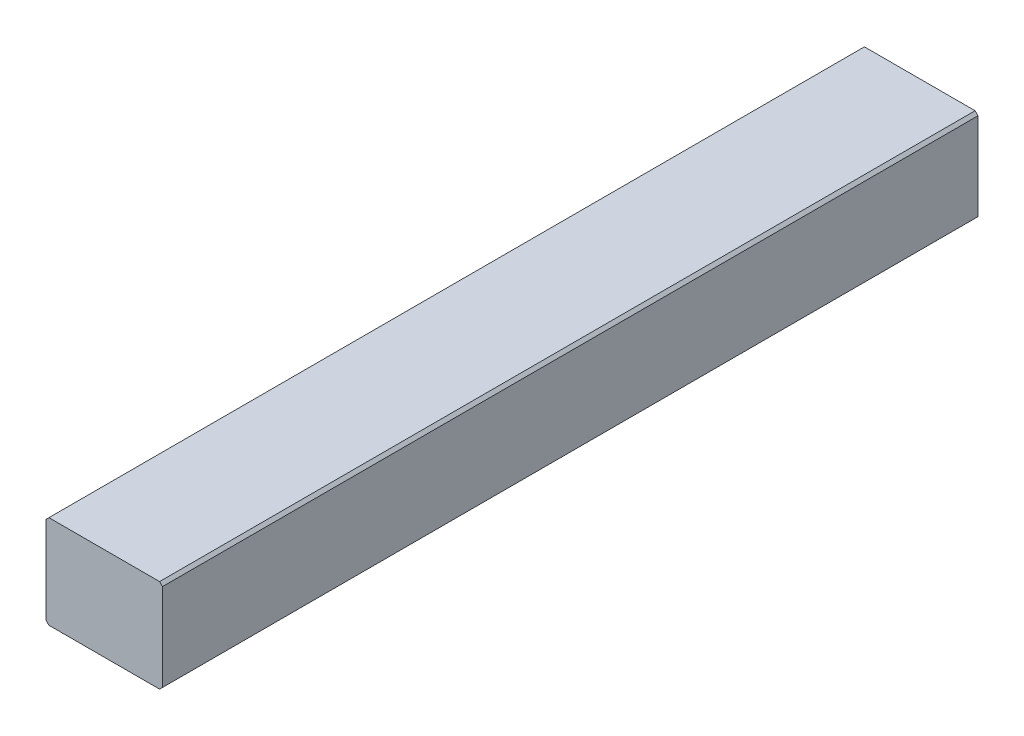
ISO-10303-21;
HEADER;
FILE_DESCRIPTION(('STEP AP214'),'2;1');
FILE_NAME('part.step','',(''),(''),'','','');
FILE_SCHEMA(('AUTOMOTIVE_DESIGN { 1 0 10303 214 1 1 1 1 }'));
ENDSEC;
DATA;
#1=APPLICATION_CONTEXT('core data for automotive mechanical design processes');
#2=APPLICATION_PROTOCOL_DEFINITION('international standard','automotive_design',2000,#1);
#3=PRODUCT_CONTEXT('',#1,'mechanical');
#4=PRODUCT('Part','Part','',(#3));
#5=PRODUCT_RELATED_PRODUCT_CATEGORY('part','',(#4));
#6=PRODUCT_DEFINITION_FORMATION('','',#4);
#7=PRODUCT_DEFINITION_CONTEXT('part definition',#1,'design');
#8=PRODUCT_DEFINITION('design','',#6,#7);
#9=PRODUCT_DEFINITION_SHAPE('','',#8);
#10=(LENGTH_UNIT() NAMED_UNIT(*) SI_UNIT(.MILLI.,.METRE.));
#11=(NAMED_UNIT(*) PLANE_ANGLE_UNIT() SI_UNIT($,.RADIAN.));
#12=(NAMED_UNIT(*) SI_UNIT($,.STERADIAN.) SOLID_ANGLE_UNIT());
#13=UNCERTAINTY_MEASURE_WITH_UNIT(LENGTH_MEASURE(1.E-05),#10,'distance_accuracy_value','');
#14=(GEOMETRIC_REPRESENTATION_CONTEXT(3) GLOBAL_UNCERTAINTY_ASSIGNED_CONTEXT((#13)) GLOBAL_UNIT_ASSIGNED_CONTEXT((#10,
#11,#12)) REPRESENTATION_CONTEXT('',''));
#15=CARTESIAN_POINT('',(0.,0.,0.));
#16=DIRECTION('',(0.,0.,1.));
#17=DIRECTION('',(1.,0.,0.));
#18=AXIS2_PLACEMENT_3D('',#15,#16,#17);
#19=CARTESIAN_POINT('',(5.,4.,70.));
#20=DIRECTION('',(-1.,0.,0.));
#21=DIRECTION('',(0.,0.,1.));
#22=AXIS2_PLACEMENT_3D('',#19,#20,#21);
#23=PLANE('',#22);
#24=DIRECTION('',(0.,1.,0.));
#25=VECTOR('',#24,1.);
#26=CARTESIAN_POINT('',(5.,4.,70.));
#27=LINE('',#26,#25);
#28=CARTESIAN_POINT('',(5.,-3.75,70.));
#29=VERTEX_POINT('',#28);
#30=CARTESIAN_POINT('',(5.,3.74999999999999,70.));
#31=VERTEX_POINT('',#30);
#32=EDGE_CURVE('E130',#29,#31,#27,.T.);
#33=ORIENTED_EDGE('',*,*,#32,.F.);
#34=DIRECTION('',(0.,0.,-1.));
#35=VECTOR('',#34,1.);
#36=CARTESIAN_POINT('',(5.,-3.75,70.));
#37=LINE('',#36,#35);
#38=CARTESIAN_POINT('',(5.,-3.75,0.));
#39=VERTEX_POINT('',#38);
#40=EDGE_CURVE('E11',#29,#39,#37,.T.);
#41=ORIENTED_EDGE('',*,*,#40,.T.);
#42=DIRECTION('',(0.,1.,0.));
#43=VECTOR('',#42,1.);
#44=CARTESIAN_POINT('',(5.,4.,0.));
#45=LINE('',#44,#43);
#46=CARTESIAN_POINT('',(5.,3.74999999999999,0.));
#47=VERTEX_POINT('',#46);
#48=EDGE_CURVE('E161',#39,#47,#45,.T.);
#49=ORIENTED_EDGE('',*,*,#48,.T.);
#50=DIRECTION('',(0.,0.,1.));
#51=VECTOR('',#50,1.);
#52=CARTESIAN_POINT('',(5.,3.74999999999999,70.));
#53=LINE('',#52,#51);
#54=EDGE_CURVE('E44',#47,#31,#53,.T.);
#55=ORIENTED_EDGE('',*,*,#54,.T.);
#56=EDGE_LOOP('',(#33,#41,#49,#55));
#57=FACE_BOUND('',#56,.T.);
#58=ADVANCED_FACE('F36',(#57),#23,.F.);
#59=CARTESIAN_POINT('',(-5.,4.,70.));
#60=DIRECTION('',(0.,-1.,0.));
#61=DIRECTION('',(0.,0.,-1.));
#62=AXIS2_PLACEMENT_3D('',#59,#60,#61);
#63=PLANE('',#62);
#64=DIRECTION('',(-1.,0.,0.));
#65=VECTOR('',#64,1.);
#66=CARTESIAN_POINT('',(-5.,4.,0.));
#67=LINE('',#66,#65);
#68=CARTESIAN_POINT('',(4.74999999999999,4.,0.));
#69=VERTEX_POINT('',#68);
#70=CARTESIAN_POINT('',(-4.74999999999999,4.,0.));
#71=VERTEX_POINT('',#70);
#72=EDGE_CURVE('E135',#69,#71,#67,.T.);
#73=ORIENTED_EDGE('',*,*,#72,.T.);
#74=DIRECTION('',(0.,0.,1.));
#75=VECTOR('',#74,1.);
#76=CARTESIAN_POINT('',(-4.74999999999999,4.,70.));
#77=LINE('',#76,#75);
#78=CARTESIAN_POINT('',(-4.74999999999999,4.,70.));
#79=VERTEX_POINT('',#78);
#80=EDGE_CURVE('E51',#71,#79,#77,.T.);
#81=ORIENTED_EDGE('',*,*,#80,.T.);
#82=DIRECTION('',(-1.,0.,0.));
#83=VECTOR('',#82,1.);
#84=CARTESIAN_POINT('',(-5.,4.,70.));
#85=LINE('',#84,#83);
#86=CARTESIAN_POINT('',(4.74999999999999,4.,70.));
#87=VERTEX_POINT('',#86);
#88=EDGE_CURVE('E133',#87,#79,#85,.T.);
#89=ORIENTED_EDGE('',*,*,#88,.F.);
#90=DIRECTION('',(0.,0.,-1.));
#91=VECTOR('',#90,1.);
#92=CARTESIAN_POINT('',(4.74999999999999,4.,70.));
#93=LINE('',#92,#91);
#94=EDGE_CURVE('E153',#87,#69,#93,.T.);
#95=ORIENTED_EDGE('',*,*,#94,.T.);
#96=EDGE_LOOP('',(#73,#81,#89,#95));
#97=FACE_BOUND('',#96,.T.);
#98=ADVANCED_FACE('F168',(#97),#63,.F.);
#99=CARTESIAN_POINT('',(-5.,4.,70.));
#100=DIRECTION('',(1.,0.,0.));
#101=DIRECTION('',(0.,0.,-1.));
#102=AXIS2_PLACEMENT_3D('',#99,#100,#101);
#103=PLANE('',#102);
#104=DIRECTION('',(0.,-1.,0.));
#105=VECTOR('',#104,1.);
#106=CARTESIAN_POINT('',(-5.,4.,0.));
#107=LINE('',#106,#105);
#108=CARTESIAN_POINT('',(-5.,3.74999999999999,0.));
#109=VERTEX_POINT('',#108);
#110=CARTESIAN_POINT('',(-5.,-3.75,0.));
#111=VERTEX_POINT('',#110);
#112=EDGE_CURVE('E131',#109,#111,#107,.T.);
#113=ORIENTED_EDGE('',*,*,#112,.T.);
#114=DIRECTION('',(0.,0.,1.));
#115=VECTOR('',#114,1.);
#116=CARTESIAN_POINT('',(-5.,-3.75,70.));
#117=LINE('',#116,#115);
#118=CARTESIAN_POINT('',(-5.,-3.75,70.));
#119=VERTEX_POINT('',#118);
#120=EDGE_CURVE('E108',#111,#119,#117,.T.);
#121=ORIENTED_EDGE('',*,*,#120,.T.);
#122=DIRECTION('',(0.,-1.,0.));
#123=VECTOR('',#122,1.);
#124=CARTESIAN_POINT('',(-5.,4.,70.));
#125=LINE('',#124,#123);
#126=CARTESIAN_POINT('',(-5.,3.74999999999999,70.));
#127=VERTEX_POINT('',#126);
#128=EDGE_CURVE('E172',#127,#119,#125,.T.);
#129=ORIENTED_EDGE('',*,*,#128,.F.);
#130=DIRECTION('',(0.,0.,-1.));
#131=VECTOR('',#130,1.);
#132=CARTESIAN_POINT('',(-5.,3.74999999999999,70.));
#133=LINE('',#132,#131);
#134=EDGE_CURVE('E113',#127,#109,#133,.T.);
#135=ORIENTED_EDGE('',*,*,#134,.T.);
#136=EDGE_LOOP('',(#113,#121,#129,#135));
#137=FACE_BOUND('',#136,.T.);
#138=ADVANCED_FACE('F180',(#137),#103,.F.);
#139=CARTESIAN_POINT('',(-5.,-4.,70.));
#140=DIRECTION('',(0.,1.,0.));
#141=DIRECTION('',(0.,0.,1.));
#142=AXIS2_PLACEMENT_3D('',#139,#140,#141);
#143=PLANE('',#142);
#144=DIRECTION('',(1.,0.,0.));
#145=VECTOR('',#144,1.);
#146=CARTESIAN_POINT('',(-5.,-4.,70.));
#147=LINE('',#146,#145);
#148=CARTESIAN_POINT('',(-4.75,-4.,70.));
#149=VERTEX_POINT('',#148);
#150=CARTESIAN_POINT('',(4.75,-4.,70.));
#151=VERTEX_POINT('',#150);
#152=EDGE_CURVE('E123',#149,#151,#147,.T.);
#153=ORIENTED_EDGE('',*,*,#152,.F.);
#154=DIRECTION('',(0.,0.,-1.));
#155=VECTOR('',#154,1.);
#156=CARTESIAN_POINT('',(-4.75,-4.,70.));
#157=LINE('',#156,#155);
#158=CARTESIAN_POINT('',(-4.75,-4.,0.));
#159=VERTEX_POINT('',#158);
#160=EDGE_CURVE('E107',#149,#159,#157,.T.);
#161=ORIENTED_EDGE('',*,*,#160,.T.);
#162=DIRECTION('',(1.,0.,0.));
#163=VECTOR('',#162,1.);
#164=CARTESIAN_POINT('',(-5.,-4.,0.));
#165=LINE('',#164,#163);
#166=CARTESIAN_POINT('',(4.75,-4.,0.));
#167=VERTEX_POINT('',#166);
#168=EDGE_CURVE('E120',#159,#167,#165,.T.);
#169=ORIENTED_EDGE('',*,*,#168,.T.);
#170=DIRECTION('',(0.,0.,1.));
#171=VECTOR('',#170,1.);
#172=CARTESIAN_POINT('',(4.75,-4.,70.));
#173=LINE('',#172,#171);
#174=EDGE_CURVE('E125',#167,#151,#173,.T.);
#175=ORIENTED_EDGE('',*,*,#174,.T.);
#176=EDGE_LOOP('',(#153,#161,#169,#175));
#177=FACE_BOUND('',#176,.T.);
#178=ADVANCED_FACE('F119',(#177),#143,.F.);
#179=CARTESIAN_POINT('',(5.,-4.,70.));
#180=DIRECTION('',(0.,0.,1.));
#181=DIRECTION('',(1.,0.,0.));
#182=AXIS2_PLACEMENT_3D('',#179,#180,#181);
#183=PLANE('',#182);
#184=ORIENTED_EDGE('',*,*,#128,.T.);
#185=DIRECTION('',(-0.707106781186548,0.707106781186548,0.));
#186=VECTOR('',#185,1.);
#187=CARTESIAN_POINT('',(0.125000000000001,-8.875,70.));
#188=LINE('',#187,#186);
#189=EDGE_CURVE('E151',#119,#149,#188,.F.);
#190=ORIENTED_EDGE('',*,*,#189,.T.);
#191=ORIENTED_EDGE('',*,*,#152,.T.);
#192=DIRECTION('',(-0.707106781186548,-0.707106781186548,0.));
#193=VECTOR('',#192,1.);
#194=CARTESIAN_POINT('',(4.875,-3.875,70.));
#195=LINE('',#194,#193);
#196=EDGE_CURVE('E147',#151,#29,#195,.F.);
#197=ORIENTED_EDGE('',*,*,#196,.T.);
#198=ORIENTED_EDGE('',*,*,#32,.T.);
#199=DIRECTION('',(0.707106781186548,-0.707106781186548,0.));
#200=VECTOR('',#199,1.);
#201=CARTESIAN_POINT('',(8.875,-0.125000000000004,70.));
#202=LINE('',#201,#200);
#203=EDGE_CURVE('E58',#31,#87,#202,.F.);
#204=ORIENTED_EDGE('',*,*,#203,.T.);
#205=ORIENTED_EDGE('',*,*,#88,.T.);
#206=DIRECTION('',(0.707106781186548,0.707106781186548,0.));
#207=VECTOR('',#206,1.);
#208=CARTESIAN_POINT('',(-3.87499999999999,4.875,70.));
#209=LINE('',#208,#207);
#210=EDGE_CURVE('E149',#79,#127,#209,.F.);
#211=ORIENTED_EDGE('',*,*,#210,.T.);
#212=EDGE_LOOP('',(#184,#190,#191,#197,#198,#204,#205,#211));
#213=FACE_BOUND('',#212,.T.);
#214=ADVANCED_FACE('F164',(#213),#183,.T.);
#215=CARTESIAN_POINT('',(5.,-4.,0.));
#216=DIRECTION('',(0.,0.,1.));
#217=DIRECTION('',(1.,0.,0.));
#218=AXIS2_PLACEMENT_3D('',#215,#216,#217);
#219=PLANE('',#218);
#220=ORIENTED_EDGE('',*,*,#168,.F.);
#221=DIRECTION('',(0.707106781186548,-0.707106781186548,0.));
#222=VECTOR('',#221,1.);
#223=CARTESIAN_POINT('',(-4.75,-4.,0.));
#224=LINE('',#223,#222);
#225=EDGE_CURVE('E103',#159,#111,#224,.F.);
#226=ORIENTED_EDGE('',*,*,#225,.T.);
#227=ORIENTED_EDGE('',*,*,#112,.F.);
#228=DIRECTION('',(-0.707106781186548,-0.707106781186548,0.));
#229=VECTOR('',#228,1.);
#230=CARTESIAN_POINT('',(-5.,3.74999999999999,0.));
#231=LINE('',#230,#229);
#232=EDGE_CURVE('E114',#109,#71,#231,.F.);
#233=ORIENTED_EDGE('',*,*,#232,.T.);
#234=ORIENTED_EDGE('',*,*,#72,.F.);
#235=DIRECTION('',(-0.707106781186548,0.707106781186548,0.));
#236=VECTOR('',#235,1.);
#237=CARTESIAN_POINT('',(4.74999999999999,4.,0.));
#238=LINE('',#237,#236);
#239=EDGE_CURVE('E124',#69,#47,#238,.F.);
#240=ORIENTED_EDGE('',*,*,#239,.T.);
#241=ORIENTED_EDGE('',*,*,#48,.F.);
#242=DIRECTION('',(0.707106781186548,0.707106781186548,0.));
#243=VECTOR('',#242,1.);
#244=CARTESIAN_POINT('',(5.,-3.75,0.));
#245=LINE('',#244,#243);
#246=EDGE_CURVE('E129',#39,#167,#245,.F.);
#247=ORIENTED_EDGE('',*,*,#246,.T.);
#248=EDGE_LOOP('',(#220,#226,#227,#233,#234,#240,#241,#247));
#249=FACE_BOUND('',#248,.T.);
#250=ADVANCED_FACE('F127',(#249),#219,.F.);
#251=CARTESIAN_POINT('',(-4.75,-4.,70.));
#252=DIRECTION('',(0.707106781186547,0.707106781186547,0.));
#253=DIRECTION('',(-0.707106781186548,0.707106781186548,0.));
#254=AXIS2_PLACEMENT_3D('',#251,#252,#253);
#255=PLANE('',#254);
#256=ORIENTED_EDGE('',*,*,#189,.F.);
#257=ORIENTED_EDGE('',*,*,#120,.F.);
#258=ORIENTED_EDGE('',*,*,#225,.F.);
#259=ORIENTED_EDGE('',*,*,#160,.F.);
#260=EDGE_LOOP('',(#256,#257,#258,#259));
#261=FACE_BOUND('',#260,.T.);
#262=ADVANCED_FACE('F106',(#261),#255,.F.);
#263=CARTESIAN_POINT('',(-5.,3.74999999999999,70.));
#264=DIRECTION('',(0.707106781186548,-0.707106781186548,0.));
#265=DIRECTION('',(0.707106781186548,0.707106781186548,0.));
#266=AXIS2_PLACEMENT_3D('',#263,#264,#265);
#267=PLANE('',#266);
#268=ORIENTED_EDGE('',*,*,#210,.F.);
#269=ORIENTED_EDGE('',*,*,#80,.F.);
#270=ORIENTED_EDGE('',*,*,#232,.F.);
#271=ORIENTED_EDGE('',*,*,#134,.F.);
#272=EDGE_LOOP('',(#268,#269,#270,#271));
#273=FACE_BOUND('',#272,.T.);
#274=ADVANCED_FACE('F178',(#273),#267,.F.);
#275=CARTESIAN_POINT('',(5.,-3.75,70.));
#276=DIRECTION('',(-0.707106781186547,0.707106781186547,0.));
#277=DIRECTION('',(-0.707106781186548,-0.707106781186548,0.));
#278=AXIS2_PLACEMENT_3D('',#275,#276,#277);
#279=PLANE('',#278);
#280=ORIENTED_EDGE('',*,*,#196,.F.);
#281=ORIENTED_EDGE('',*,*,#174,.F.);
#282=ORIENTED_EDGE('',*,*,#246,.F.);
#283=ORIENTED_EDGE('',*,*,#40,.F.);
#284=EDGE_LOOP('',(#280,#281,#282,#283));
#285=FACE_BOUND('',#284,.T.);
#286=ADVANCED_FACE('F182',(#285),#279,.F.);
#287=CARTESIAN_POINT('',(4.74999999999999,4.,70.));
#288=DIRECTION('',(-0.707106781186548,-0.707106781186548,0.));
#289=DIRECTION('',(0.707106781186548,-0.707106781186548,0.));
#290=AXIS2_PLACEMENT_3D('',#287,#288,#289);
#291=PLANE('',#290);
#292=ORIENTED_EDGE('',*,*,#203,.F.);
#293=ORIENTED_EDGE('',*,*,#54,.F.);
#294=ORIENTED_EDGE('',*,*,#239,.F.);
#295=ORIENTED_EDGE('',*,*,#94,.F.);
#296=EDGE_LOOP('',(#292,#293,#294,#295));
#297=FACE_BOUND('',#296,.T.);
#298=ADVANCED_FACE('F38',(#297),#291,.F.);
#299=CLOSED_SHELL('',(#58,#98,#138,#178,#214,#250,#262,#274,#286,#298));
#300=MANIFOLD_SOLID_BREP('B2',#299);
#301=ADVANCED_BREP_SHAPE_REPRESENTATION('',(#18,#300),#14);
#302=SHAPE_DEFINITION_REPRESENTATION(#9,#301);
ENDSEC;
END-ISO-10303-21;
